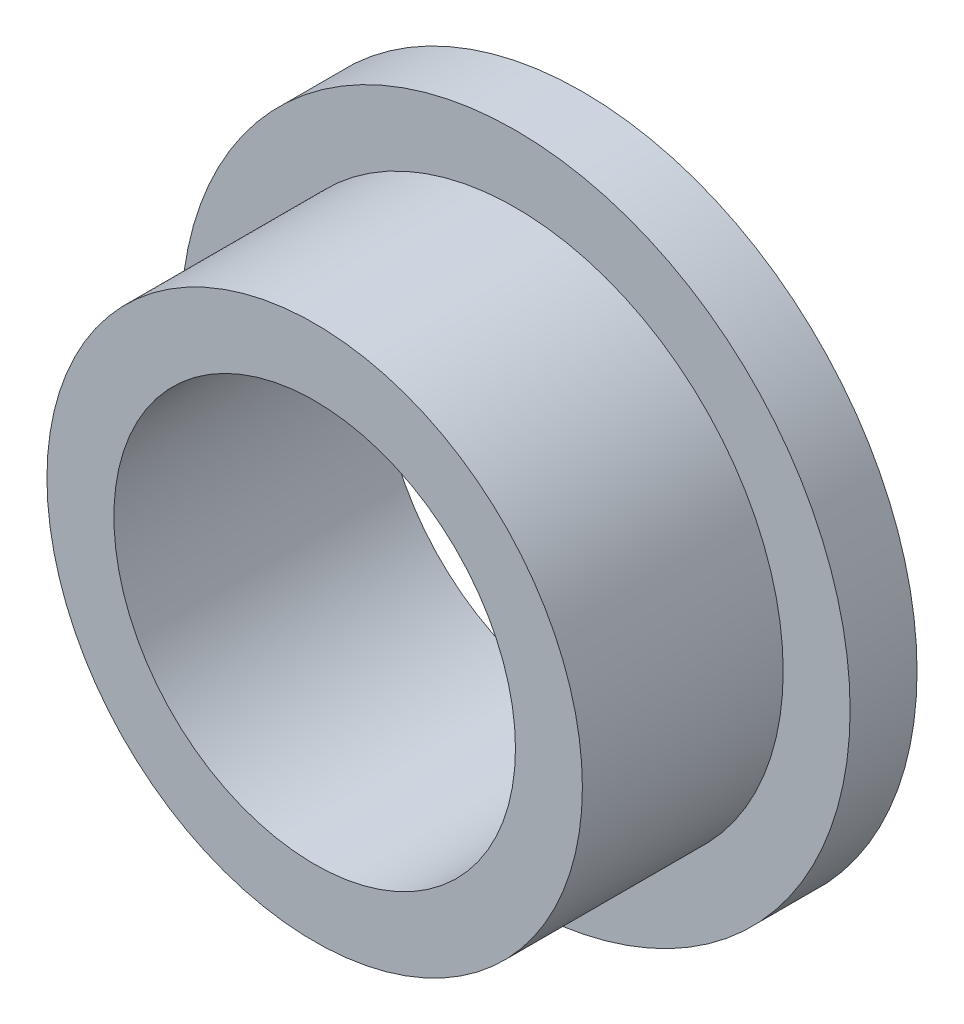
ISO-10303-21;
HEADER;
FILE_DESCRIPTION(('STEP AP214'),'2;1');
FILE_NAME('part.step','',(''),(''),'','','');
FILE_SCHEMA(('AUTOMOTIVE_DESIGN { 1 0 10303 214 1 1 1 1 }'));
ENDSEC;
DATA;
#1=APPLICATION_CONTEXT('core data for automotive mechanical design processes');
#2=APPLICATION_PROTOCOL_DEFINITION('international standard','automotive_design',2000,#1);
#3=PRODUCT_CONTEXT('',#1,'mechanical');
#4=PRODUCT('Part','Part','',(#3));
#5=PRODUCT_RELATED_PRODUCT_CATEGORY('part','',(#4));
#6=PRODUCT_DEFINITION_FORMATION('','',#4);
#7=PRODUCT_DEFINITION_CONTEXT('part definition',#1,'design');
#8=PRODUCT_DEFINITION('design','',#6,#7);
#9=PRODUCT_DEFINITION_SHAPE('','',#8);
#10=(LENGTH_UNIT() NAMED_UNIT(*) SI_UNIT(.MILLI.,.METRE.));
#11=(NAMED_UNIT(*) PLANE_ANGLE_UNIT() SI_UNIT($,.RADIAN.));
#12=(NAMED_UNIT(*) SI_UNIT($,.STERADIAN.) SOLID_ANGLE_UNIT());
#13=UNCERTAINTY_MEASURE_WITH_UNIT(LENGTH_MEASURE(1.E-05),#10,'distance_accuracy_value','');
#14=(GEOMETRIC_REPRESENTATION_CONTEXT(3) GLOBAL_UNCERTAINTY_ASSIGNED_CONTEXT((#13)) GLOBAL_UNIT_ASSIGNED_CONTEXT((#10,
#11,#12)) REPRESENTATION_CONTEXT('',''));
#15=CARTESIAN_POINT('',(0.,0.,0.));
#16=DIRECTION('',(0.,0.,1.));
#17=DIRECTION('',(1.,0.,0.));
#18=AXIS2_PLACEMENT_3D('',#15,#16,#17);
#19=CARTESIAN_POINT('',(0.,4.,0.));
#20=DIRECTION('',(0.,0.,-1.));
#21=DIRECTION('',(-1.,0.,0.));
#22=AXIS2_PLACEMENT_3D('',#19,#20,#21);
#23=PLANE('',#22);
#24=CARTESIAN_POINT('',(0.,0.,0.));
#25=DIRECTION('',(0.,0.,1.));
#26=DIRECTION('',(1.,0.,0.));
#27=AXIS2_PLACEMENT_3D('',#24,#25,#26);
#28=CIRCLE('',#27,3.);
#29=CARTESIAN_POINT('',(3.,0.,0.));
#30=VERTEX_POINT('',#29);
#31=EDGE_CURVE('E10',#30,#30,#28,.T.);
#32=ORIENTED_EDGE('',*,*,#31,.F.);
#33=EDGE_LOOP('',(#32));
#34=FACE_BOUND('',#33,.T.);
#35=CARTESIAN_POINT('',(0.,0.,0.));
#36=DIRECTION('',(0.,0.,1.));
#37=DIRECTION('',(1.,0.,0.));
#38=AXIS2_PLACEMENT_3D('',#35,#36,#37);
#39=CIRCLE('',#38,4.);
#40=CARTESIAN_POINT('',(4.,0.,0.));
#41=VERTEX_POINT('',#40);
#42=EDGE_CURVE('E54',#41,#41,#39,.T.);
#43=ORIENTED_EDGE('',*,*,#42,.T.);
#44=EDGE_LOOP('',(#43));
#45=FACE_BOUND('',#44,.T.);
#46=ADVANCED_FACE('F32',(#34,#45),#23,.F.);
#47=CARTESIAN_POINT('',(0.,0.,0.));
#48=DIRECTION('',(0.,0.,1.));
#49=DIRECTION('',(1.,0.,0.));
#50=AXIS2_PLACEMENT_3D('',#47,#48,#49);
#51=CYLINDRICAL_SURFACE('',#50,3.);
#52=CARTESIAN_POINT('',(0.,0.,-4.));
#53=DIRECTION('',(0.,0.,1.));
#54=DIRECTION('',(1.,0.,0.));
#55=AXIS2_PLACEMENT_3D('',#52,#53,#54);
#56=CIRCLE('',#55,3.);
#57=CARTESIAN_POINT('',(3.,0.,-4.));
#58=VERTEX_POINT('',#57);
#59=EDGE_CURVE('E38',#58,#58,#56,.T.);
#60=ORIENTED_EDGE('',*,*,#59,.F.);
#61=EDGE_LOOP('',(#60));
#62=FACE_BOUND('',#61,.T.);
#63=ORIENTED_EDGE('',*,*,#31,.T.);
#64=EDGE_LOOP('',(#63));
#65=FACE_BOUND('',#64,.T.);
#66=ADVANCED_FACE('F79',(#62,#65),#51,.F.);
#67=CARTESIAN_POINT('',(0.,3.,-4.));
#68=DIRECTION('',(0.,0.,1.));
#69=DIRECTION('',(1.,0.,0.));
#70=AXIS2_PLACEMENT_3D('',#67,#68,#69);
#71=PLANE('',#70);
#72=CARTESIAN_POINT('',(0.,0.,-4.));
#73=DIRECTION('',(0.,0.,1.));
#74=DIRECTION('',(1.,0.,0.));
#75=AXIS2_PLACEMENT_3D('',#72,#73,#74);
#76=CIRCLE('',#75,5.);
#77=CARTESIAN_POINT('',(5.,0.,-4.));
#78=VERTEX_POINT('',#77);
#79=EDGE_CURVE('E42',#78,#78,#76,.T.);
#80=ORIENTED_EDGE('',*,*,#79,.F.);
#81=EDGE_LOOP('',(#80));
#82=FACE_BOUND('',#81,.T.);
#83=ORIENTED_EDGE('',*,*,#59,.T.);
#84=EDGE_LOOP('',(#83));
#85=FACE_BOUND('',#84,.T.);
#86=ADVANCED_FACE('F74',(#82,#85),#71,.F.);
#87=CARTESIAN_POINT('',(0.,0.,0.));
#88=DIRECTION('',(0.,0.,1.));
#89=DIRECTION('',(1.,0.,0.));
#90=AXIS2_PLACEMENT_3D('',#87,#88,#89);
#91=CYLINDRICAL_SURFACE('',#90,5.);
#92=CARTESIAN_POINT('',(0.,0.,-3.));
#93=DIRECTION('',(0.,0.,1.));
#94=DIRECTION('',(1.,0.,0.));
#95=AXIS2_PLACEMENT_3D('',#92,#93,#94);
#96=CIRCLE('',#95,5.);
#97=CARTESIAN_POINT('',(5.,0.,-3.));
#98=VERTEX_POINT('',#97);
#99=EDGE_CURVE('E46',#98,#98,#96,.T.);
#100=ORIENTED_EDGE('',*,*,#99,.F.);
#101=EDGE_LOOP('',(#100));
#102=FACE_BOUND('',#101,.T.);
#103=ORIENTED_EDGE('',*,*,#79,.T.);
#104=EDGE_LOOP('',(#103));
#105=FACE_BOUND('',#104,.T.);
#106=ADVANCED_FACE('F68',(#102,#105),#91,.T.);
#107=CARTESIAN_POINT('',(0.,5.,-3.));
#108=DIRECTION('',(0.,0.,-1.));
#109=DIRECTION('',(-1.,0.,0.));
#110=AXIS2_PLACEMENT_3D('',#107,#108,#109);
#111=PLANE('',#110);
#112=CARTESIAN_POINT('',(0.,0.,-3.));
#113=DIRECTION('',(0.,0.,1.));
#114=DIRECTION('',(1.,0.,0.));
#115=AXIS2_PLACEMENT_3D('',#112,#113,#114);
#116=CIRCLE('',#115,4.);
#117=CARTESIAN_POINT('',(4.,0.,-3.));
#118=VERTEX_POINT('',#117);
#119=EDGE_CURVE('E51',#118,#118,#116,.T.);
#120=ORIENTED_EDGE('',*,*,#119,.F.);
#121=EDGE_LOOP('',(#120));
#122=FACE_BOUND('',#121,.T.);
#123=ORIENTED_EDGE('',*,*,#99,.T.);
#124=EDGE_LOOP('',(#123));
#125=FACE_BOUND('',#124,.T.);
#126=ADVANCED_FACE('F62',(#122,#125),#111,.F.);
#127=CARTESIAN_POINT('',(0.,0.,0.));
#128=DIRECTION('',(0.,0.,1.));
#129=DIRECTION('',(1.,0.,0.));
#130=AXIS2_PLACEMENT_3D('',#127,#128,#129);
#131=CYLINDRICAL_SURFACE('',#130,4.);
#132=ORIENTED_EDGE('',*,*,#42,.F.);
#133=EDGE_LOOP('',(#132));
#134=FACE_BOUND('',#133,.T.);
#135=ORIENTED_EDGE('',*,*,#119,.T.);
#136=EDGE_LOOP('',(#135));
#137=FACE_BOUND('',#136,.T.);
#138=ADVANCED_FACE('F59',(#134,#137),#131,.T.);
#139=CLOSED_SHELL('',(#46,#66,#86,#106,#126,#138));
#140=MANIFOLD_SOLID_BREP('B2',#139);
#141=ADVANCED_BREP_SHAPE_REPRESENTATION('',(#18,#140),#14);
#142=SHAPE_DEFINITION_REPRESENTATION(#9,#141);
ENDSEC;
END-ISO-10303-21;
